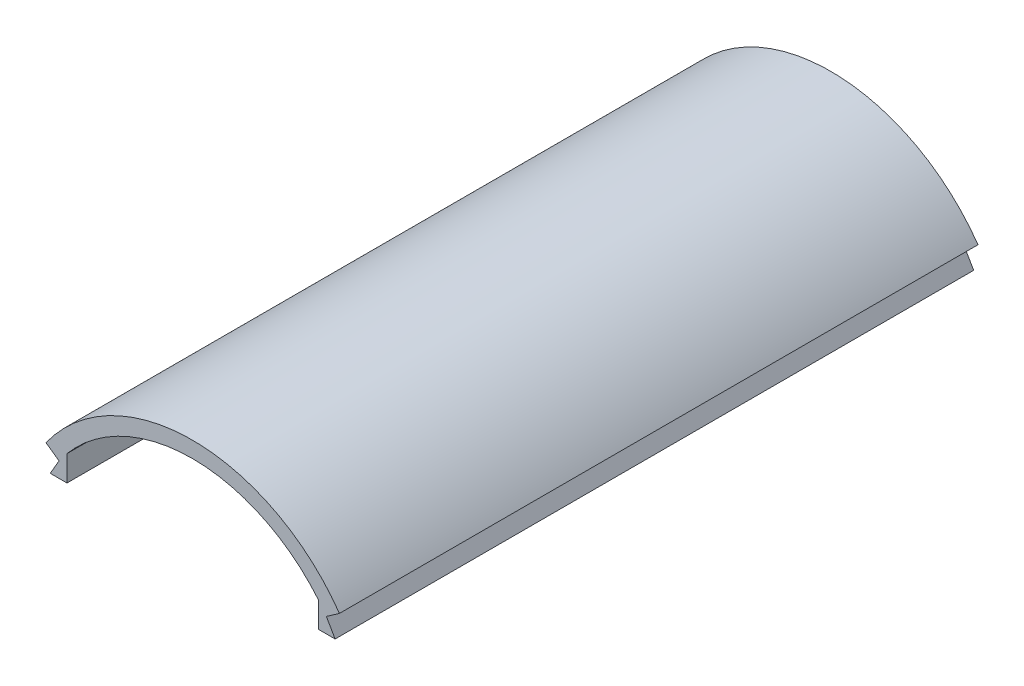
ISO-10303-21;
HEADER;
FILE_DESCRIPTION(('STEP AP214'),'2;1');
FILE_NAME('part.step','',(''),(''),'','','');
FILE_SCHEMA(('AUTOMOTIVE_DESIGN { 1 0 10303 214 1 1 1 1 }'));
ENDSEC;
DATA;
#1=APPLICATION_CONTEXT('core data for automotive mechanical design processes');
#2=APPLICATION_PROTOCOL_DEFINITION('international standard','automotive_design',2000,#1);
#3=PRODUCT_CONTEXT('',#1,'mechanical');
#4=PRODUCT('Part','Part','',(#3));
#5=PRODUCT_RELATED_PRODUCT_CATEGORY('part','',(#4));
#6=PRODUCT_DEFINITION_FORMATION('','',#4);
#7=PRODUCT_DEFINITION_CONTEXT('part definition',#1,'design');
#8=PRODUCT_DEFINITION('design','',#6,#7);
#9=PRODUCT_DEFINITION_SHAPE('','',#8);
#10=(LENGTH_UNIT() NAMED_UNIT(*) SI_UNIT(.MILLI.,.METRE.));
#11=(NAMED_UNIT(*) PLANE_ANGLE_UNIT() SI_UNIT($,.RADIAN.));
#12=(NAMED_UNIT(*) SI_UNIT($,.STERADIAN.) SOLID_ANGLE_UNIT());
#13=UNCERTAINTY_MEASURE_WITH_UNIT(LENGTH_MEASURE(1.E-05),#10,'distance_accuracy_value','');
#14=(GEOMETRIC_REPRESENTATION_CONTEXT(3) GLOBAL_UNCERTAINTY_ASSIGNED_CONTEXT((#13)) GLOBAL_UNIT_ASSIGNED_CONTEXT((#10,
#11,#12)) REPRESENTATION_CONTEXT('',''));
#15=CARTESIAN_POINT('',(0.,0.,0.));
#16=DIRECTION('',(0.,0.,1.));
#17=DIRECTION('',(1.,0.,0.));
#18=AXIS2_PLACEMENT_3D('',#15,#16,#17);
#19=CARTESIAN_POINT('',(0.,0.,80.));
#20=DIRECTION('',(0.,0.,1.));
#21=DIRECTION('',(1.,0.,0.));
#22=AXIS2_PLACEMENT_3D('',#19,#20,#21);
#23=PLANE('',#22);
#24=DIRECTION('',(0.,1.,0.));
#25=VECTOR('',#24,1.);
#26=CARTESIAN_POINT('',(15.7926169079243,0.,80.));
#27=LINE('',#26,#25);
#28=CARTESIAN_POINT('',(15.7926169079243,9.85831694519647,80.));
#29=VERTEX_POINT('',#28);
#30=CARTESIAN_POINT('',(15.7926169079243,13.0707020163243,80.));
#31=VERTEX_POINT('',#30);
#32=EDGE_CURVE('E204',#29,#31,#27,.T.);
#33=ORIENTED_EDGE('',*,*,#32,.F.);
#34=DIRECTION('',(1.,0.,0.));
#35=VECTOR('',#34,1.);
#36=CARTESIAN_POINT('',(0.,9.85831694519647,80.));
#37=LINE('',#36,#35);
#38=CARTESIAN_POINT('',(17.8895824193846,9.85831694519647,80.));
#39=VERTEX_POINT('',#38);
#40=EDGE_CURVE('E206',#29,#39,#37,.T.);
#41=ORIENTED_EDGE('',*,*,#40,.T.);
#42=DIRECTION('',(-0.500000000000006,0.866025403784435,0.));
#43=VECTOR('',#42,1.);
#44=CARTESIAN_POINT('',(17.6859632710878,10.2109956554405,80.));
#45=LINE('',#44,#43);
#46=CARTESIAN_POINT('',(16.7926169079243,11.7583169451965,80.));
#47=VERTEX_POINT('',#46);
#48=EDGE_CURVE('E209',#39,#47,#45,.T.);
#49=ORIENTED_EDGE('',*,*,#48,.T.);
#50=DIRECTION('',(0.819152044288992,0.573576436351046,0.));
#51=VECTOR('',#50,1.);
#52=CARTESIAN_POINT('',(0.,0.,80.));
#53=LINE('',#52,#51);
#54=CARTESIAN_POINT('',(18.4309209965023,12.9054698178986,80.));
#55=VERTEX_POINT('',#54);
#56=EDGE_CURVE('E185',#47,#55,#53,.T.);
#57=ORIENTED_EDGE('',*,*,#56,.T.);
#58=CARTESIAN_POINT('',(0.,0.,80.));
#59=DIRECTION('',(0.,0.,1.));
#60=DIRECTION('',(1.,0.,0.));
#61=AXIS2_PLACEMENT_3D('',#58,#59,#60);
#62=CIRCLE('',#61,22.5);
#63=CARTESIAN_POINT('',(-18.331762870111,13.045936918214,80.));
#64=VERTEX_POINT('',#63);
#65=EDGE_CURVE('E212',#64,#55,#62,.F.);
#66=ORIENTED_EDGE('',*,*,#65,.F.);
#67=DIRECTION('',(-0.814745016449377,0.579819418587291,0.));
#68=VECTOR('',#67,1.);
#69=CARTESIAN_POINT('',(0.,0.,80.));
#70=LINE('',#69,#68);
#71=CARTESIAN_POINT('',(-16.7022728372122,11.8862980810395,80.));
#72=VERTEX_POINT('',#71);
#73=EDGE_CURVE('E171',#72,#64,#70,.T.);
#74=ORIENTED_EDGE('',*,*,#73,.F.);
#75=DIRECTION('',(0.500000000000004,0.866025403784437,0.));
#76=VECTOR('',#75,1.);
#77=CARTESIAN_POINT('',(-17.6736226754763,10.2038708092422,80.));
#78=LINE('',#77,#76);
#79=CARTESIAN_POINT('',(-17.7992383486725,9.98629808103946,80.));
#80=VERTEX_POINT('',#79);
#81=EDGE_CURVE('E176',#80,#72,#78,.T.);
#82=ORIENTED_EDGE('',*,*,#81,.F.);
#83=DIRECTION('',(-1.,0.,0.));
#84=VECTOR('',#83,1.);
#85=CARTESIAN_POINT('',(0.,9.98629808103946,80.));
#86=LINE('',#85,#84);
#87=CARTESIAN_POINT('',(-15.7022728372122,9.98629808103946,80.));
#88=VERTEX_POINT('',#87);
#89=EDGE_CURVE('E196',#88,#80,#86,.T.);
#90=ORIENTED_EDGE('',*,*,#89,.F.);
#91=DIRECTION('',(0.,1.,0.));
#92=VECTOR('',#91,1.);
#93=CARTESIAN_POINT('',(-15.7022728372122,0.,80.));
#94=LINE('',#93,#92);
#95=CARTESIAN_POINT('',(-15.7022728372122,13.1790981385582,80.));
#96=VERTEX_POINT('',#95);
#97=EDGE_CURVE('E199',#88,#96,#94,.T.);
#98=ORIENTED_EDGE('',*,*,#97,.T.);
#99=CARTESIAN_POINT('',(0.,0.,80.));
#100=DIRECTION('',(0.,0.,1.));
#101=DIRECTION('',(1.,0.,0.));
#102=AXIS2_PLACEMENT_3D('',#99,#100,#101);
#103=CIRCLE('',#102,20.5);
#104=EDGE_CURVE('E201',#96,#31,#103,.F.);
#105=ORIENTED_EDGE('',*,*,#104,.T.);
#106=EDGE_LOOP('',(#33,#41,#49,#57,#66,#74,#82,#90,#98,#105));
#107=FACE_BOUND('',#106,.T.);
#108=ADVANCED_FACE('F89',(#107),#23,.T.);
#109=CARTESIAN_POINT('',(0.,0.,0.));
#110=DIRECTION('',(0.,0.,1.));
#111=DIRECTION('',(1.,0.,0.));
#112=AXIS2_PLACEMENT_3D('',#109,#110,#111);
#113=PLANE('',#112);
#114=DIRECTION('',(-1.,0.,0.));
#115=VECTOR('',#114,1.);
#116=CARTESIAN_POINT('',(0.,9.85831694519647,0.));
#117=LINE('',#116,#115);
#118=CARTESIAN_POINT('',(17.8895824193846,9.85831694519647,0.));
#119=VERTEX_POINT('',#118);
#120=CARTESIAN_POINT('',(15.7926169079243,9.85831694519647,0.));
#121=VERTEX_POINT('',#120);
#122=EDGE_CURVE('E190',#119,#121,#117,.T.);
#123=ORIENTED_EDGE('',*,*,#122,.T.);
#124=DIRECTION('',(0.,-1.,0.));
#125=VECTOR('',#124,1.);
#126=CARTESIAN_POINT('',(15.7926169079243,0.,0.));
#127=LINE('',#126,#125);
#128=CARTESIAN_POINT('',(15.7926169079243,13.0707020163243,0.));
#129=VERTEX_POINT('',#128);
#130=EDGE_CURVE('E103',#129,#121,#127,.T.);
#131=ORIENTED_EDGE('',*,*,#130,.F.);
#132=CARTESIAN_POINT('',(0.,0.,0.));
#133=DIRECTION('',(0.,0.,1.));
#134=DIRECTION('',(1.,0.,0.));
#135=AXIS2_PLACEMENT_3D('',#132,#133,#134);
#136=CIRCLE('',#135,20.5);
#137=CARTESIAN_POINT('',(-15.7022728372122,13.1790981385582,0.));
#138=VERTEX_POINT('',#137);
#139=EDGE_CURVE('E238',#129,#138,#136,.T.);
#140=ORIENTED_EDGE('',*,*,#139,.T.);
#141=DIRECTION('',(0.,-1.,0.));
#142=VECTOR('',#141,1.);
#143=CARTESIAN_POINT('',(-15.7022728372122,0.,0.));
#144=LINE('',#143,#142);
#145=CARTESIAN_POINT('',(-15.7022728372122,9.98629808103946,0.));
#146=VERTEX_POINT('',#145);
#147=EDGE_CURVE('E234',#138,#146,#144,.T.);
#148=ORIENTED_EDGE('',*,*,#147,.T.);
#149=DIRECTION('',(1.,0.,0.));
#150=VECTOR('',#149,1.);
#151=CARTESIAN_POINT('',(0.,9.98629808103946,0.));
#152=LINE('',#151,#150);
#153=CARTESIAN_POINT('',(-17.7992383486725,9.98629808103946,0.));
#154=VERTEX_POINT('',#153);
#155=EDGE_CURVE('E231',#154,#146,#152,.T.);
#156=ORIENTED_EDGE('',*,*,#155,.F.);
#157=DIRECTION('',(-0.500000000000004,-0.866025403784437,0.));
#158=VECTOR('',#157,1.);
#159=CARTESIAN_POINT('',(-17.6736226754763,10.2038708092422,0.));
#160=LINE('',#159,#158);
#161=CARTESIAN_POINT('',(-16.7022728372122,11.8862980810395,0.));
#162=VERTEX_POINT('',#161);
#163=EDGE_CURVE('E183',#162,#154,#160,.T.);
#164=ORIENTED_EDGE('',*,*,#163,.F.);
#165=DIRECTION('',(-0.814745016449377,0.579819418587291,0.));
#166=VECTOR('',#165,1.);
#167=CARTESIAN_POINT('',(0.,0.,0.));
#168=LINE('',#167,#166);
#169=CARTESIAN_POINT('',(-18.331762870111,13.045936918214,0.));
#170=VERTEX_POINT('',#169);
#171=EDGE_CURVE('E168',#162,#170,#168,.T.);
#172=ORIENTED_EDGE('',*,*,#171,.T.);
#173=CARTESIAN_POINT('',(0.,0.,0.));
#174=DIRECTION('',(0.,0.,1.));
#175=DIRECTION('',(1.,0.,0.));
#176=AXIS2_PLACEMENT_3D('',#173,#174,#175);
#177=CIRCLE('',#176,22.5);
#178=CARTESIAN_POINT('',(18.4309209965023,12.9054698178986,0.));
#179=VERTEX_POINT('',#178);
#180=EDGE_CURVE('E180',#179,#170,#177,.T.);
#181=ORIENTED_EDGE('',*,*,#180,.F.);
#182=DIRECTION('',(0.819152044288992,0.573576436351046,0.));
#183=VECTOR('',#182,1.);
#184=CARTESIAN_POINT('',(0.,0.,0.));
#185=LINE('',#184,#183);
#186=CARTESIAN_POINT('',(16.7926169079243,11.7583169451965,0.));
#187=VERTEX_POINT('',#186);
#188=EDGE_CURVE('E111',#187,#179,#185,.T.);
#189=ORIENTED_EDGE('',*,*,#188,.F.);
#190=DIRECTION('',(0.500000000000006,-0.866025403784435,0.));
#191=VECTOR('',#190,1.);
#192=CARTESIAN_POINT('',(17.6859632710878,10.2109956554405,0.));
#193=LINE('',#192,#191);
#194=EDGE_CURVE('E188',#187,#119,#193,.T.);
#195=ORIENTED_EDGE('',*,*,#194,.T.);
#196=EDGE_LOOP('',(#123,#131,#140,#148,#156,#164,#172,#181,#189,#195));
#197=FACE_BOUND('',#196,.T.);
#198=ADVANCED_FACE('F179',(#197),#113,.F.);
#199=CARTESIAN_POINT('',(-17.6736226754763,10.2038708092422,-38.8839094648189));
#200=DIRECTION('',(0.866025403784437,-0.500000000000003,0.));
#201=DIRECTION('',(0.500000000000004,0.866025403784437,0.));
#202=AXIS2_PLACEMENT_3D('',#199,#200,#201);
#203=PLANE('',#202);
#204=DIRECTION('',(0.,0.,1.));
#205=VECTOR('',#204,1.);
#206=CARTESIAN_POINT('',(-16.7022728372122,11.8862980810395,-38.8839094648189));
#207=LINE('',#206,#205);
#208=EDGE_CURVE('E214',#162,#72,#207,.T.);
#209=ORIENTED_EDGE('',*,*,#208,.F.);
#210=ORIENTED_EDGE('',*,*,#163,.T.);
#211=DIRECTION('',(0.,0.,1.));
#212=VECTOR('',#211,1.);
#213=CARTESIAN_POINT('',(-17.7992383486725,9.98629808103946,-38.8839094648189));
#214=LINE('',#213,#212);
#215=EDGE_CURVE('E228',#154,#80,#214,.T.);
#216=ORIENTED_EDGE('',*,*,#215,.T.);
#217=ORIENTED_EDGE('',*,*,#81,.T.);
#218=EDGE_LOOP('',(#209,#210,#216,#217));
#219=FACE_BOUND('',#218,.T.);
#220=ADVANCED_FACE('F264',(#219),#203,.F.);
#221=CARTESIAN_POINT('',(0.,9.98629808103946,-38.8839094648189));
#222=DIRECTION('',(0.,1.,0.));
#223=DIRECTION('',(0.,0.,1.));
#224=AXIS2_PLACEMENT_3D('',#221,#222,#223);
#225=PLANE('',#224);
#226=ORIENTED_EDGE('',*,*,#215,.F.);
#227=ORIENTED_EDGE('',*,*,#155,.T.);
#228=DIRECTION('',(0.,0.,1.));
#229=VECTOR('',#228,1.);
#230=CARTESIAN_POINT('',(-15.7022728372122,9.98629808103946,-38.8839094648189));
#231=LINE('',#230,#229);
#232=EDGE_CURVE('E225',#146,#88,#231,.T.);
#233=ORIENTED_EDGE('',*,*,#232,.T.);
#234=ORIENTED_EDGE('',*,*,#89,.T.);
#235=EDGE_LOOP('',(#226,#227,#233,#234));
#236=FACE_BOUND('',#235,.T.);
#237=ADVANCED_FACE('F263',(#236),#225,.F.);
#238=CARTESIAN_POINT('',(-15.7022728372122,0.,-38.8839094648189));
#239=DIRECTION('',(1.,0.,0.));
#240=DIRECTION('',(0.,0.,-1.));
#241=AXIS2_PLACEMENT_3D('',#238,#239,#240);
#242=PLANE('',#241);
#243=ORIENTED_EDGE('',*,*,#97,.F.);
#244=ORIENTED_EDGE('',*,*,#232,.F.);
#245=ORIENTED_EDGE('',*,*,#147,.F.);
#246=DIRECTION('',(0.,0.,1.));
#247=VECTOR('',#246,1.);
#248=CARTESIAN_POINT('',(-15.7022728372122,13.1790981385582,-38.8839094648189));
#249=LINE('',#248,#247);
#250=EDGE_CURVE('E222',#138,#96,#249,.T.);
#251=ORIENTED_EDGE('',*,*,#250,.T.);
#252=EDGE_LOOP('',(#243,#244,#245,#251));
#253=FACE_BOUND('',#252,.T.);
#254=ADVANCED_FACE('F262',(#253),#242,.T.);
#255=CARTESIAN_POINT('',(0.,0.,-38.8839094648189));
#256=DIRECTION('',(0.,0.,1.));
#257=DIRECTION('',(1.,0.,0.));
#258=AXIS2_PLACEMENT_3D('',#255,#256,#257);
#259=CYLINDRICAL_SURFACE('',#258,20.5);
#260=ORIENTED_EDGE('',*,*,#139,.F.);
#261=DIRECTION('',(0.,0.,1.));
#262=VECTOR('',#261,1.);
#263=CARTESIAN_POINT('',(15.7926169079243,13.0707020163243,-38.8839094648189));
#264=LINE('',#263,#262);
#265=EDGE_CURVE('E219',#129,#31,#264,.T.);
#266=ORIENTED_EDGE('',*,*,#265,.T.);
#267=ORIENTED_EDGE('',*,*,#104,.F.);
#268=ORIENTED_EDGE('',*,*,#250,.F.);
#269=EDGE_LOOP('',(#260,#266,#267,#268));
#270=FACE_BOUND('',#269,.T.);
#271=ADVANCED_FACE('F255',(#270),#259,.F.);
#272=CARTESIAN_POINT('',(15.7926169079243,0.,-38.8839094648189));
#273=DIRECTION('',(1.,0.,0.));
#274=DIRECTION('',(0.,0.,-1.));
#275=AXIS2_PLACEMENT_3D('',#272,#273,#274);
#276=PLANE('',#275);
#277=ORIENTED_EDGE('',*,*,#130,.T.);
#278=DIRECTION('',(0.,0.,1.));
#279=VECTOR('',#278,1.);
#280=CARTESIAN_POINT('',(15.7926169079243,9.85831694519647,-38.8839094648189));
#281=LINE('',#280,#279);
#282=EDGE_CURVE('E217',#121,#29,#281,.T.);
#283=ORIENTED_EDGE('',*,*,#282,.T.);
#284=ORIENTED_EDGE('',*,*,#32,.T.);
#285=ORIENTED_EDGE('',*,*,#265,.F.);
#286=EDGE_LOOP('',(#277,#283,#284,#285));
#287=FACE_BOUND('',#286,.T.);
#288=ADVANCED_FACE('F250',(#287),#276,.F.);
#289=CARTESIAN_POINT('',(0.,9.85831694519647,-38.8839094648189));
#290=DIRECTION('',(0.,-1.,0.));
#291=DIRECTION('',(0.,0.,-1.));
#292=AXIS2_PLACEMENT_3D('',#289,#290,#291);
#293=PLANE('',#292);
#294=ORIENTED_EDGE('',*,*,#122,.F.);
#295=DIRECTION('',(0.,0.,1.));
#296=VECTOR('',#295,1.);
#297=CARTESIAN_POINT('',(17.8895824193846,9.85831694519647,-38.8839094648189));
#298=LINE('',#297,#296);
#299=EDGE_CURVE('E215',#119,#39,#298,.T.);
#300=ORIENTED_EDGE('',*,*,#299,.T.);
#301=ORIENTED_EDGE('',*,*,#40,.F.);
#302=ORIENTED_EDGE('',*,*,#282,.F.);
#303=EDGE_LOOP('',(#294,#300,#301,#302));
#304=FACE_BOUND('',#303,.T.);
#305=ADVANCED_FACE('F249',(#304),#293,.T.);
#306=CARTESIAN_POINT('',(17.6859632710878,10.2109956554405,-38.8839094648189));
#307=DIRECTION('',(0.866025403784435,0.500000000000006,0.));
#308=DIRECTION('',(-0.500000000000006,0.866025403784435,0.));
#309=AXIS2_PLACEMENT_3D('',#306,#307,#308);
#310=PLANE('',#309);
#311=ORIENTED_EDGE('',*,*,#194,.F.);
#312=DIRECTION('',(0.,0.,1.));
#313=VECTOR('',#312,1.);
#314=CARTESIAN_POINT('',(16.7926169079243,11.7583169451965,-15.0317964777569));
#315=LINE('',#314,#313);
#316=EDGE_CURVE('E12',#187,#47,#315,.T.);
#317=ORIENTED_EDGE('',*,*,#316,.T.);
#318=ORIENTED_EDGE('',*,*,#48,.F.);
#319=ORIENTED_EDGE('',*,*,#299,.F.);
#320=EDGE_LOOP('',(#311,#317,#318,#319));
#321=FACE_BOUND('',#320,.T.);
#322=ADVANCED_FACE('F271',(#321),#310,.T.);
#323=CARTESIAN_POINT('',(0.,0.,-38.8839094648189));
#324=DIRECTION('',(0.,0.,1.));
#325=DIRECTION('',(1.,0.,0.));
#326=AXIS2_PLACEMENT_3D('',#323,#324,#325);
#327=CYLINDRICAL_SURFACE('',#326,22.5);
#328=ORIENTED_EDGE('',*,*,#180,.T.);
#329=DIRECTION('',(0.,0.,1.));
#330=VECTOR('',#329,1.);
#331=CARTESIAN_POINT('',(-18.331762870111,13.045936918214,0.));
#332=LINE('',#331,#330);
#333=EDGE_CURVE('E165',#170,#64,#332,.T.);
#334=ORIENTED_EDGE('',*,*,#333,.T.);
#335=ORIENTED_EDGE('',*,*,#65,.T.);
#336=DIRECTION('',(0.,0.,1.));
#337=VECTOR('',#336,1.);
#338=CARTESIAN_POINT('',(18.4309209965023,12.9054698178986,-15.0317964777569));
#339=LINE('',#338,#337);
#340=EDGE_CURVE('E92',#179,#55,#339,.T.);
#341=ORIENTED_EDGE('',*,*,#340,.F.);
#342=EDGE_LOOP('',(#328,#334,#335,#341));
#343=FACE_BOUND('',#342,.T.);
#344=ADVANCED_FACE('F187',(#343),#327,.T.);
#345=CARTESIAN_POINT('',(0.,0.,0.));
#346=DIRECTION('',(0.579819418587291,0.814745016449377,0.));
#347=DIRECTION('',(-0.814745016449377,0.579819418587291,0.));
#348=AXIS2_PLACEMENT_3D('',#345,#346,#347);
#349=PLANE('',#348);
#350=ORIENTED_EDGE('',*,*,#73,.T.);
#351=ORIENTED_EDGE('',*,*,#333,.F.);
#352=ORIENTED_EDGE('',*,*,#171,.F.);
#353=ORIENTED_EDGE('',*,*,#208,.T.);
#354=EDGE_LOOP('',(#350,#351,#352,#353));
#355=FACE_BOUND('',#354,.T.);
#356=ADVANCED_FACE('F167',(#355),#349,.F.);
#357=CARTESIAN_POINT('',(0.,0.,0.));
#358=DIRECTION('',(0.573576436351046,-0.819152044288992,0.));
#359=DIRECTION('',(0.819152044288992,0.573576436351046,0.));
#360=AXIS2_PLACEMENT_3D('',#357,#358,#359);
#361=PLANE('',#360);
#362=ORIENTED_EDGE('',*,*,#56,.F.);
#363=ORIENTED_EDGE('',*,*,#316,.F.);
#364=ORIENTED_EDGE('',*,*,#188,.T.);
#365=ORIENTED_EDGE('',*,*,#340,.T.);
#366=EDGE_LOOP('',(#362,#363,#364,#365));
#367=FACE_BOUND('',#366,.T.);
#368=ADVANCED_FACE('F269',(#367),#361,.T.);
#369=CLOSED_SHELL('',(#108,#198,#220,#237,#254,#271,#288,#305,#322,#344,#356,#368));
#370=MANIFOLD_SOLID_BREP('B2',#369);
#371=ADVANCED_BREP_SHAPE_REPRESENTATION('',(#18,#370),#14);
#372=SHAPE_DEFINITION_REPRESENTATION(#9,#371);
ENDSEC;
END-ISO-10303-21;
